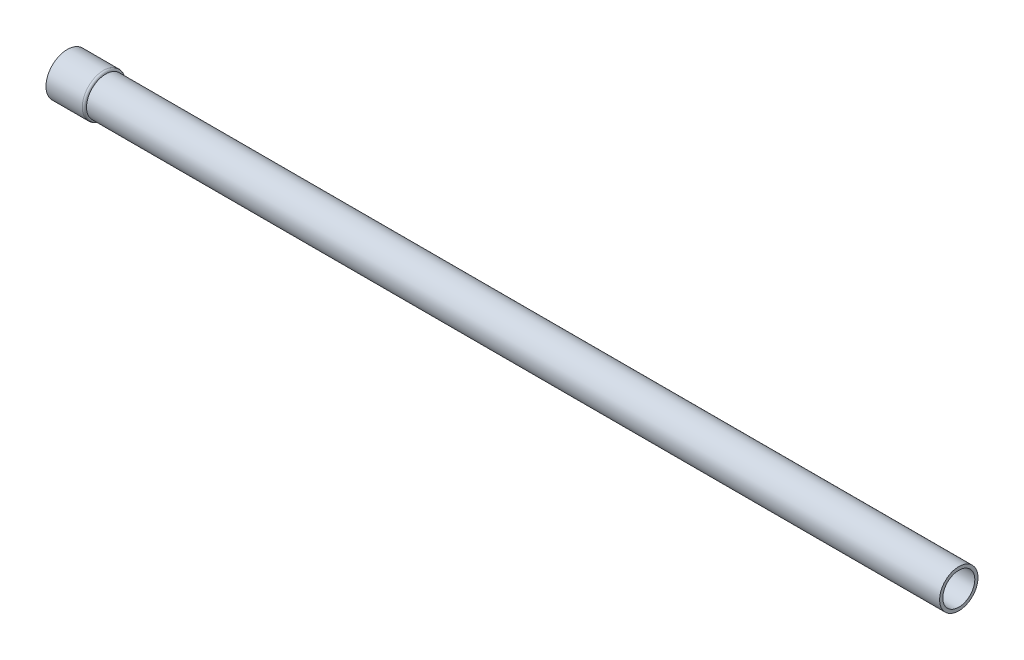
ISO-10303-21;
HEADER;
FILE_DESCRIPTION(('STEP AP214'),'2;1');
FILE_NAME('part.step','',(''),(''),'','','');
FILE_SCHEMA(('AUTOMOTIVE_DESIGN { 1 0 10303 214 1 1 1 1 }'));
ENDSEC;
DATA;
#1=APPLICATION_CONTEXT('core data for automotive mechanical design processes');
#2=APPLICATION_PROTOCOL_DEFINITION('international standard','automotive_design',2000,#1);
#3=PRODUCT_CONTEXT('',#1,'mechanical');
#4=PRODUCT('Part','Part','',(#3));
#5=PRODUCT_RELATED_PRODUCT_CATEGORY('part','',(#4));
#6=PRODUCT_DEFINITION_FORMATION('','',#4);
#7=PRODUCT_DEFINITION_CONTEXT('part definition',#1,'design');
#8=PRODUCT_DEFINITION('design','',#6,#7);
#9=PRODUCT_DEFINITION_SHAPE('','',#8);
#10=(LENGTH_UNIT() NAMED_UNIT(*) SI_UNIT(.MILLI.,.METRE.));
#11=(NAMED_UNIT(*) PLANE_ANGLE_UNIT() SI_UNIT($,.RADIAN.));
#12=(NAMED_UNIT(*) SI_UNIT($,.STERADIAN.) SOLID_ANGLE_UNIT());
#13=UNCERTAINTY_MEASURE_WITH_UNIT(LENGTH_MEASURE(1.E-05),#10,'distance_accuracy_value','');
#14=(GEOMETRIC_REPRESENTATION_CONTEXT(3) GLOBAL_UNCERTAINTY_ASSIGNED_CONTEXT((#13)) GLOBAL_UNIT_ASSIGNED_CONTEXT((#10,
#11,#12)) REPRESENTATION_CONTEXT('',''));
#15=CARTESIAN_POINT('',(0.,0.,0.));
#16=DIRECTION('',(0.,0.,1.));
#17=DIRECTION('',(1.,0.,0.));
#18=AXIS2_PLACEMENT_3D('',#15,#16,#17);
#19=CARTESIAN_POINT('',(0.,0.,0.));
#20=DIRECTION('',(1.,0.,0.));
#21=DIRECTION('',(0.,0.,-1.));
#22=AXIS2_PLACEMENT_3D('',#19,#20,#21);
#23=PLANE('',#22);
#24=CARTESIAN_POINT('',(0.,0.,0.));
#25=DIRECTION('',(1.,0.,0.));
#26=DIRECTION('',(0.,0.,-1.));
#27=AXIS2_PLACEMENT_3D('',#24,#25,#26);
#28=CIRCLE('',#27,7.5);
#29=CARTESIAN_POINT('',(0.,0.,-7.5));
#30=VERTEX_POINT('',#29);
#31=EDGE_CURVE('E57',#30,#30,#28,.T.);
#32=ORIENTED_EDGE('',*,*,#31,.T.);
#33=EDGE_LOOP('',(#32));
#34=FACE_BOUND('',#33,.T.);
#35=CARTESIAN_POINT('',(0.,0.,0.));
#36=DIRECTION('',(1.,0.,0.));
#37=DIRECTION('',(0.,0.,-1.));
#38=AXIS2_PLACEMENT_3D('',#35,#36,#37);
#39=CIRCLE('',#38,8.5);
#40=CARTESIAN_POINT('',(0.,0.,-8.5));
#41=VERTEX_POINT('',#40);
#42=EDGE_CURVE('E44',#41,#41,#39,.T.);
#43=ORIENTED_EDGE('',*,*,#42,.F.);
#44=EDGE_LOOP('',(#43));
#45=FACE_BOUND('',#44,.T.);
#46=ADVANCED_FACE('F36',(#34,#45),#23,.F.);
#47=CARTESIAN_POINT('',(400.,0.,0.));
#48=DIRECTION('',(1.,0.,0.));
#49=DIRECTION('',(0.,0.,-1.));
#50=AXIS2_PLACEMENT_3D('',#47,#48,#49);
#51=PLANE('',#50);
#52=CARTESIAN_POINT('',(400.,0.,0.));
#53=DIRECTION('',(1.,0.,0.));
#54=DIRECTION('',(0.,0.,-1.));
#55=AXIS2_PLACEMENT_3D('',#52,#53,#54);
#56=CIRCLE('',#55,9.);
#57=CARTESIAN_POINT('',(400.,0.,-9.));
#58=VERTEX_POINT('',#57);
#59=EDGE_CURVE('E49',#58,#58,#56,.T.);
#60=ORIENTED_EDGE('',*,*,#59,.T.);
#61=EDGE_LOOP('',(#60));
#62=FACE_BOUND('',#61,.T.);
#63=CARTESIAN_POINT('',(400.,0.,0.));
#64=DIRECTION('',(1.,0.,0.));
#65=DIRECTION('',(0.,0.,-1.));
#66=AXIS2_PLACEMENT_3D('',#63,#64,#65);
#67=CIRCLE('',#66,7.5);
#68=CARTESIAN_POINT('',(400.,0.,-7.5));
#69=VERTEX_POINT('',#68);
#70=EDGE_CURVE('E54',#69,#69,#67,.T.);
#71=ORIENTED_EDGE('',*,*,#70,.F.);
#72=EDGE_LOOP('',(#71));
#73=FACE_BOUND('',#72,.T.);
#74=ADVANCED_FACE('F97',(#62,#73),#51,.T.);
#75=CARTESIAN_POINT('',(400.,0.,0.));
#76=DIRECTION('',(-1.,0.,0.));
#77=DIRECTION('',(0.,0.,1.));
#78=AXIS2_PLACEMENT_3D('',#75,#76,#77);
#79=CYLINDRICAL_SURFACE('',#78,9.);
#80=ORIENTED_EDGE('',*,*,#59,.F.);
#81=EDGE_LOOP('',(#80));
#82=FACE_BOUND('',#81,.T.);
#83=CARTESIAN_POINT('',(0.,0.,0.));
#84=DIRECTION('',(1.,0.,0.));
#85=DIRECTION('',(0.,0.,-1.));
#86=AXIS2_PLACEMENT_3D('',#83,#84,#85);
#87=CIRCLE('',#86,9.);
#88=CARTESIAN_POINT('',(0.,0.,-9.));
#89=VERTEX_POINT('',#88);
#90=EDGE_CURVE('E61',#89,#89,#87,.T.);
#91=ORIENTED_EDGE('',*,*,#90,.T.);
#92=EDGE_LOOP('',(#91));
#93=FACE_BOUND('',#92,.T.);
#94=ADVANCED_FACE('F92',(#82,#93),#79,.T.);
#95=CARTESIAN_POINT('',(400.,0.,0.));
#96=DIRECTION('',(-1.,0.,0.));
#97=DIRECTION('',(0.,0.,1.));
#98=AXIS2_PLACEMENT_3D('',#95,#96,#97);
#99=CYLINDRICAL_SURFACE('',#98,7.5);
#100=ORIENTED_EDGE('',*,*,#70,.T.);
#101=EDGE_LOOP('',(#100));
#102=FACE_BOUND('',#101,.T.);
#103=ORIENTED_EDGE('',*,*,#31,.F.);
#104=EDGE_LOOP('',(#103));
#105=FACE_BOUND('',#104,.T.);
#106=ADVANCED_FACE('F82',(#102,#105),#99,.F.);
#107=CARTESIAN_POINT('',(28.2842712474619,0.,0.));
#108=DIRECTION('',(-1.,0.,0.));
#109=DIRECTION('',(0.,0.,1.));
#110=AXIS2_PLACEMENT_3D('',#107,#108,#109);
#111=CYLINDRICAL_SURFACE('',#110,10.);
#112=CARTESIAN_POINT('',(-1.,0.,0.));
#113=DIRECTION('',(1.,0.,0.));
#114=DIRECTION('',(0.,0.,-1.));
#115=AXIS2_PLACEMENT_3D('',#112,#113,#114);
#116=CIRCLE('',#115,10.);
#117=CARTESIAN_POINT('',(-1.,0.,-10.));
#118=VERTEX_POINT('',#117);
#119=EDGE_CURVE('E10',#118,#118,#116,.F.);
#120=ORIENTED_EDGE('',*,*,#119,.T.);
#121=EDGE_LOOP('',(#120));
#122=FACE_BOUND('',#121,.T.);
#123=CARTESIAN_POINT('',(-18.,0.,0.));
#124=DIRECTION('',(-1.,0.,0.));
#125=DIRECTION('',(0.,0.,1.));
#126=AXIS2_PLACEMENT_3D('',#123,#124,#125);
#127=CIRCLE('',#126,10.);
#128=CARTESIAN_POINT('',(-18.,0.,10.));
#129=VERTEX_POINT('',#128);
#130=EDGE_CURVE('E68',#129,#129,#127,.T.);
#131=ORIENTED_EDGE('',*,*,#130,.F.);
#132=EDGE_LOOP('',(#131));
#133=FACE_BOUND('',#132,.T.);
#134=ADVANCED_FACE('F79',(#122,#133),#111,.T.);
#135=CARTESIAN_POINT('',(28.2842712474619,0.,0.));
#136=DIRECTION('',(-1.,0.,0.));
#137=DIRECTION('',(0.,0.,1.));
#138=AXIS2_PLACEMENT_3D('',#135,#136,#137);
#139=CYLINDRICAL_SURFACE('',#138,8.5);
#140=CARTESIAN_POINT('',(-18.,0.,0.));
#141=DIRECTION('',(-1.,0.,0.));
#142=DIRECTION('',(0.,0.,1.));
#143=AXIS2_PLACEMENT_3D('',#140,#141,#142);
#144=CIRCLE('',#143,8.5);
#145=CARTESIAN_POINT('',(-18.,0.,8.5));
#146=VERTEX_POINT('',#145);
#147=EDGE_CURVE('E69',#146,#146,#144,.T.);
#148=ORIENTED_EDGE('',*,*,#147,.T.);
#149=EDGE_LOOP('',(#148));
#150=FACE_BOUND('',#149,.T.);
#151=ORIENTED_EDGE('',*,*,#42,.T.);
#152=EDGE_LOOP('',(#151));
#153=FACE_BOUND('',#152,.T.);
#154=ADVANCED_FACE('F81',(#150,#153),#139,.F.);
#155=CARTESIAN_POINT('',(-18.,0.,0.));
#156=DIRECTION('',(-1.,0.,0.));
#157=DIRECTION('',(0.,0.,1.));
#158=AXIS2_PLACEMENT_3D('',#155,#156,#157);
#159=PLANE('',#158);
#160=ORIENTED_EDGE('',*,*,#147,.F.);
#161=EDGE_LOOP('',(#160));
#162=FACE_BOUND('',#161,.T.);
#163=ORIENTED_EDGE('',*,*,#130,.T.);
#164=EDGE_LOOP('',(#163));
#165=FACE_BOUND('',#164,.T.);
#166=ADVANCED_FACE('F77',(#162,#165),#159,.T.);
#167=CARTESIAN_POINT('',(-1.,0.,0.));
#168=DIRECTION('',(1.,0.,0.));
#169=DIRECTION('',(0.,0.,-1.));
#170=AXIS2_PLACEMENT_3D('',#167,#168,#169);
#171=TOROIDAL_SURFACE('',#170,9.,1.);
#172=ORIENTED_EDGE('',*,*,#90,.F.);
#173=EDGE_LOOP('',(#172));
#174=FACE_BOUND('',#173,.T.);
#175=ORIENTED_EDGE('',*,*,#119,.F.);
#176=EDGE_LOOP('',(#175));
#177=FACE_BOUND('',#176,.T.);
#178=ADVANCED_FACE('F38',(#174,#177),#171,.T.);
#179=CLOSED_SHELL('',(#46,#74,#94,#106,#134,#154,#166,#178));
#180=MANIFOLD_SOLID_BREP('B2',#179);
#181=ADVANCED_BREP_SHAPE_REPRESENTATION('',(#18,#180),#14);
#182=SHAPE_DEFINITION_REPRESENTATION(#9,#181);
ENDSEC;
END-ISO-10303-21;
